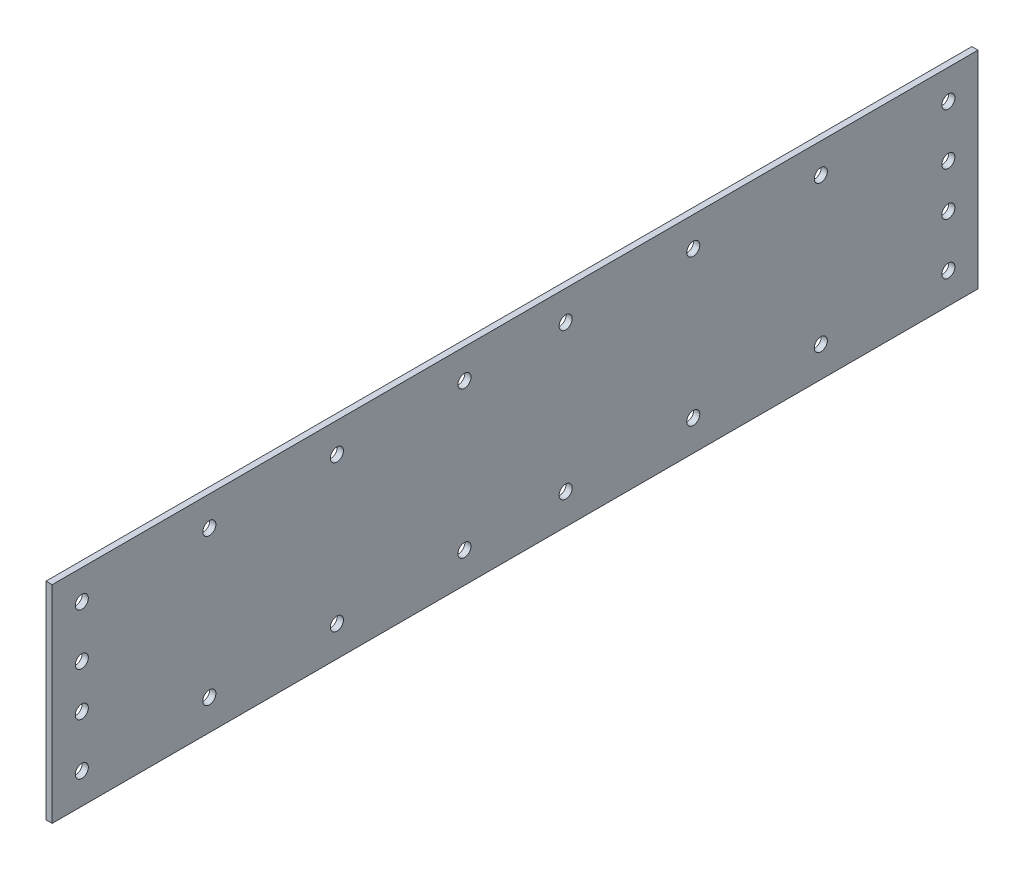
ISO-10303-21;
HEADER;
FILE_DESCRIPTION(('STEP AP214'),'2;1');
FILE_NAME('part.step','',(''),(''),'','','');
FILE_SCHEMA(('AUTOMOTIVE_DESIGN { 1 0 10303 214 1 1 1 1 }'));
ENDSEC;
DATA;
#1=APPLICATION_CONTEXT('core data for automotive mechanical design processes');
#2=APPLICATION_PROTOCOL_DEFINITION('international standard','automotive_design',2000,#1);
#3=PRODUCT_CONTEXT('',#1,'mechanical');
#4=PRODUCT('Part','Part','',(#3));
#5=PRODUCT_RELATED_PRODUCT_CATEGORY('part','',(#4));
#6=PRODUCT_DEFINITION_FORMATION('','',#4);
#7=PRODUCT_DEFINITION_CONTEXT('part definition',#1,'design');
#8=PRODUCT_DEFINITION('design','',#6,#7);
#9=PRODUCT_DEFINITION_SHAPE('','',#8);
#10=(LENGTH_UNIT() NAMED_UNIT(*) SI_UNIT(.MILLI.,.METRE.));
#11=(NAMED_UNIT(*) PLANE_ANGLE_UNIT() SI_UNIT($,.RADIAN.));
#12=(NAMED_UNIT(*) SI_UNIT($,.STERADIAN.) SOLID_ANGLE_UNIT());
#13=UNCERTAINTY_MEASURE_WITH_UNIT(LENGTH_MEASURE(1.E-05),#10,'distance_accuracy_value','');
#14=(GEOMETRIC_REPRESENTATION_CONTEXT(3) GLOBAL_UNCERTAINTY_ASSIGNED_CONTEXT((#13)) GLOBAL_UNIT_ASSIGNED_CONTEXT((#10,
#11,#12)) REPRESENTATION_CONTEXT('',''));
#15=CARTESIAN_POINT('',(0.,0.,0.));
#16=DIRECTION('',(0.,0.,1.));
#17=DIRECTION('',(1.,0.,0.));
#18=AXIS2_PLACEMENT_3D('',#15,#16,#17);
#19=CARTESIAN_POINT('',(-203.,50.,225.));
#20=DIRECTION('',(0.,0.,1.));
#21=DIRECTION('',(0.,-1.,0.));
#22=AXIS2_PLACEMENT_3D('',#19,#20,#21);
#23=PLANE('',#22);
#24=DIRECTION('',(0.,-1.,0.));
#25=VECTOR('',#24,1.);
#26=CARTESIAN_POINT('',(-200.,50.,225.));
#27=LINE('',#26,#25);
#28=CARTESIAN_POINT('',(-200.,50.,225.));
#29=VERTEX_POINT('',#28);
#30=CARTESIAN_POINT('',(-200.,-50.5044410875939,225.));
#31=VERTEX_POINT('',#30);
#32=EDGE_CURVE('E106',#29,#31,#27,.T.);
#33=ORIENTED_EDGE('',*,*,#32,.F.);
#34=DIRECTION('',(1.,0.,0.));
#35=VECTOR('',#34,1.);
#36=CARTESIAN_POINT('',(-203.,50.,225.));
#37=LINE('',#36,#35);
#38=CARTESIAN_POINT('',(-203.,50.,225.));
#39=VERTEX_POINT('',#38);
#40=EDGE_CURVE('E11',#39,#29,#37,.T.);
#41=ORIENTED_EDGE('',*,*,#40,.F.);
#42=DIRECTION('',(0.,-1.,0.));
#43=VECTOR('',#42,1.);
#44=CARTESIAN_POINT('',(-203.,50.,225.));
#45=LINE('',#44,#43);
#46=CARTESIAN_POINT('',(-203.,-50.5044410875939,225.));
#47=VERTEX_POINT('',#46);
#48=EDGE_CURVE('E99',#39,#47,#45,.T.);
#49=ORIENTED_EDGE('',*,*,#48,.T.);
#50=DIRECTION('',(1.,0.,0.));
#51=VECTOR('',#50,1.);
#52=CARTESIAN_POINT('',(-203.,-50.5044410875939,225.));
#53=LINE('',#52,#51);
#54=EDGE_CURVE('E44',#47,#31,#53,.T.);
#55=ORIENTED_EDGE('',*,*,#54,.T.);
#56=EDGE_LOOP('',(#33,#41,#49,#55));
#57=FACE_BOUND('',#56,.T.);
#58=ADVANCED_FACE('F41',(#57),#23,.T.);
#59=CARTESIAN_POINT('',(-203.,50.,225.));
#60=DIRECTION('',(0.,1.,0.));
#61=DIRECTION('',(0.,0.,1.));
#62=AXIS2_PLACEMENT_3D('',#59,#60,#61);
#63=PLANE('',#62);
#64=DIRECTION('',(0.,0.,1.));
#65=VECTOR('',#64,1.);
#66=CARTESIAN_POINT('',(-200.,50.,225.));
#67=LINE('',#66,#65);
#68=CARTESIAN_POINT('',(-200.,50.,-225.));
#69=VERTEX_POINT('',#68);
#70=EDGE_CURVE('E101',#69,#29,#67,.T.);
#71=ORIENTED_EDGE('',*,*,#70,.F.);
#72=DIRECTION('',(1.,0.,0.));
#73=VECTOR('',#72,1.);
#74=CARTESIAN_POINT('',(-203.,50.,-225.));
#75=LINE('',#74,#73);
#76=CARTESIAN_POINT('',(-203.,50.,-225.));
#77=VERTEX_POINT('',#76);
#78=EDGE_CURVE('E50',#77,#69,#75,.T.);
#79=ORIENTED_EDGE('',*,*,#78,.F.);
#80=DIRECTION('',(0.,0.,1.));
#81=VECTOR('',#80,1.);
#82=CARTESIAN_POINT('',(-203.,50.,225.));
#83=LINE('',#82,#81);
#84=EDGE_CURVE('E96',#77,#39,#83,.T.);
#85=ORIENTED_EDGE('',*,*,#84,.T.);
#86=ORIENTED_EDGE('',*,*,#40,.T.);
#87=EDGE_LOOP('',(#71,#79,#85,#86));
#88=FACE_BOUND('',#87,.T.);
#89=ADVANCED_FACE('F117',(#88),#63,.T.);
#90=CARTESIAN_POINT('',(-203.,50.,-225.));
#91=DIRECTION('',(0.,0.,-1.));
#92=DIRECTION('',(0.,1.,0.));
#93=AXIS2_PLACEMENT_3D('',#90,#91,#92);
#94=PLANE('',#93);
#95=DIRECTION('',(0.,1.,0.));
#96=VECTOR('',#95,1.);
#97=CARTESIAN_POINT('',(-200.,50.,-225.));
#98=LINE('',#97,#96);
#99=CARTESIAN_POINT('',(-200.,-50.5044410875939,-225.));
#100=VERTEX_POINT('',#99);
#101=EDGE_CURVE('E91',#100,#69,#98,.T.);
#102=ORIENTED_EDGE('',*,*,#101,.F.);
#103=DIRECTION('',(1.,0.,0.));
#104=VECTOR('',#103,1.);
#105=CARTESIAN_POINT('',(-203.,-50.5044410875939,-225.));
#106=LINE('',#105,#104);
#107=CARTESIAN_POINT('',(-203.,-50.5044410875939,-225.));
#108=VERTEX_POINT('',#107);
#109=EDGE_CURVE('E86',#108,#100,#106,.T.);
#110=ORIENTED_EDGE('',*,*,#109,.F.);
#111=DIRECTION('',(0.,1.,0.));
#112=VECTOR('',#111,1.);
#113=CARTESIAN_POINT('',(-203.,50.,-225.));
#114=LINE('',#113,#112);
#115=EDGE_CURVE('E89',#108,#77,#114,.T.);
#116=ORIENTED_EDGE('',*,*,#115,.T.);
#117=ORIENTED_EDGE('',*,*,#78,.T.);
#118=EDGE_LOOP('',(#102,#110,#116,#117));
#119=FACE_BOUND('',#118,.T.);
#120=ADVANCED_FACE('F88',(#119),#94,.T.);
#121=CARTESIAN_POINT('',(-203.,-50.5044410875939,225.));
#122=DIRECTION('',(0.,-1.,0.));
#123=DIRECTION('',(0.,0.,-1.));
#124=AXIS2_PLACEMENT_3D('',#121,#122,#123);
#125=PLANE('',#124);
#126=DIRECTION('',(0.,0.,-1.));
#127=VECTOR('',#126,1.);
#128=CARTESIAN_POINT('',(-200.,-50.5044410875939,225.));
#129=LINE('',#128,#127);
#130=EDGE_CURVE('E109',#31,#100,#129,.T.);
#131=ORIENTED_EDGE('',*,*,#130,.F.);
#132=ORIENTED_EDGE('',*,*,#54,.F.);
#133=DIRECTION('',(0.,0.,-1.));
#134=VECTOR('',#133,1.);
#135=CARTESIAN_POINT('',(-203.,-50.5044410875939,225.));
#136=LINE('',#135,#134);
#137=EDGE_CURVE('E95',#47,#108,#136,.T.);
#138=ORIENTED_EDGE('',*,*,#137,.T.);
#139=ORIENTED_EDGE('',*,*,#109,.T.);
#140=EDGE_LOOP('',(#131,#132,#138,#139));
#141=FACE_BOUND('',#140,.T.);
#142=ADVANCED_FACE('F98',(#141),#125,.T.);
#143=CARTESIAN_POINT('',(-203.,0.,0.));
#144=DIRECTION('',(1.,0.,0.));
#145=DIRECTION('',(0.,0.,-1.));
#146=AXIS2_PLACEMENT_3D('',#143,#144,#145);
#147=PLANE('',#146);
#148=CARTESIAN_POINT('',(-203.,35.6,-148.6));
#149=DIRECTION('',(1.,0.,0.));
#150=DIRECTION('',(0.,0.,1.));
#151=AXIS2_PLACEMENT_3D('',#148,#149,#150);
#152=CIRCLE('',#151,3.175);
#153=CARTESIAN_POINT('',(-203.,35.6,-145.425));
#154=VERTEX_POINT('',#153);
#155=EDGE_CURVE('E222',#154,#154,#152,.T.);
#156=ORIENTED_EDGE('',*,*,#155,.T.);
#157=EDGE_LOOP('',(#156));
#158=FACE_BOUND('',#157,.T.);
#159=CARTESIAN_POINT('',(-203.,-35.6,-148.6));
#160=DIRECTION('',(1.,0.,0.));
#161=DIRECTION('',(0.,0.,1.));
#162=AXIS2_PLACEMENT_3D('',#159,#160,#161);
#163=CIRCLE('',#162,3.175);
#164=CARTESIAN_POINT('',(-203.,-35.6,-145.425));
#165=VERTEX_POINT('',#164);
#166=EDGE_CURVE('E230',#165,#165,#163,.T.);
#167=ORIENTED_EDGE('',*,*,#166,.T.);
#168=EDGE_LOOP('',(#167));
#169=FACE_BOUND('',#168,.T.);
#170=CARTESIAN_POINT('',(-203.,35.6,-86.6));
#171=DIRECTION('',(1.,0.,0.));
#172=DIRECTION('',(0.,0.,1.));
#173=AXIS2_PLACEMENT_3D('',#170,#171,#172);
#174=CIRCLE('',#173,3.17499999999997);
#175=CARTESIAN_POINT('',(-203.,35.6,-83.4250000000001));
#176=VERTEX_POINT('',#175);
#177=EDGE_CURVE('E236',#176,#176,#174,.T.);
#178=ORIENTED_EDGE('',*,*,#177,.T.);
#179=EDGE_LOOP('',(#178));
#180=FACE_BOUND('',#179,.T.);
#181=CARTESIAN_POINT('',(-203.,-35.6,-86.6000000000001));
#182=DIRECTION('',(1.,0.,0.));
#183=DIRECTION('',(0.,0.,1.));
#184=AXIS2_PLACEMENT_3D('',#181,#182,#183);
#185=CIRCLE('',#184,3.17499999999997);
#186=CARTESIAN_POINT('',(-203.,-35.6,-83.4250000000001));
#187=VERTEX_POINT('',#186);
#188=EDGE_CURVE('E242',#187,#187,#185,.T.);
#189=ORIENTED_EDGE('',*,*,#188,.T.);
#190=EDGE_LOOP('',(#189));
#191=FACE_BOUND('',#190,.T.);
#192=CARTESIAN_POINT('',(-203.,35.6,-24.6));
#193=DIRECTION('',(1.,0.,0.));
#194=DIRECTION('',(0.,0.,1.));
#195=AXIS2_PLACEMENT_3D('',#192,#193,#194);
#196=CIRCLE('',#195,3.17499999999996);
#197=CARTESIAN_POINT('',(-203.,35.6,-21.4250000000001));
#198=VERTEX_POINT('',#197);
#199=EDGE_CURVE('E248',#198,#198,#196,.T.);
#200=ORIENTED_EDGE('',*,*,#199,.T.);
#201=EDGE_LOOP('',(#200));
#202=FACE_BOUND('',#201,.T.);
#203=CARTESIAN_POINT('',(-203.,-35.6,-24.6000000000001));
#204=DIRECTION('',(1.,0.,0.));
#205=DIRECTION('',(0.,0.,1.));
#206=AXIS2_PLACEMENT_3D('',#203,#204,#205);
#207=CIRCLE('',#206,3.17499999999996);
#208=CARTESIAN_POINT('',(-203.,-35.6,-21.4250000000001));
#209=VERTEX_POINT('',#208);
#210=EDGE_CURVE('E254',#209,#209,#207,.T.);
#211=ORIENTED_EDGE('',*,*,#210,.T.);
#212=EDGE_LOOP('',(#211));
#213=FACE_BOUND('',#212,.T.);
#214=CARTESIAN_POINT('',(-203.,35.6,24.6000000000001));
#215=DIRECTION('',(1.,0.,0.));
#216=DIRECTION('',(0.,0.,-1.));
#217=AXIS2_PLACEMENT_3D('',#214,#215,#216);
#218=CIRCLE('',#217,3.17499999999997);
#219=CARTESIAN_POINT('',(-203.,35.6,21.4250000000001));
#220=VERTEX_POINT('',#219);
#221=EDGE_CURVE('E260',#220,#220,#218,.T.);
#222=ORIENTED_EDGE('',*,*,#221,.T.);
#223=EDGE_LOOP('',(#222));
#224=FACE_BOUND('',#223,.T.);
#225=CARTESIAN_POINT('',(-203.,-35.6,24.6000000000001));
#226=DIRECTION('',(1.,0.,0.));
#227=DIRECTION('',(0.,0.,-1.));
#228=AXIS2_PLACEMENT_3D('',#225,#226,#227);
#229=CIRCLE('',#228,3.17499999999997);
#230=CARTESIAN_POINT('',(-203.,-35.6,21.4250000000001));
#231=VERTEX_POINT('',#230);
#232=EDGE_CURVE('E266',#231,#231,#229,.T.);
#233=ORIENTED_EDGE('',*,*,#232,.T.);
#234=EDGE_LOOP('',(#233));
#235=FACE_BOUND('',#234,.T.);
#236=CARTESIAN_POINT('',(-203.,35.6,86.6000000000001));
#237=DIRECTION('',(1.,0.,0.));
#238=DIRECTION('',(0.,0.,-1.));
#239=AXIS2_PLACEMENT_3D('',#236,#237,#238);
#240=CIRCLE('',#239,3.17499999999997);
#241=CARTESIAN_POINT('',(-203.,35.6,83.4250000000001));
#242=VERTEX_POINT('',#241);
#243=EDGE_CURVE('E272',#242,#242,#240,.T.);
#244=ORIENTED_EDGE('',*,*,#243,.T.);
#245=EDGE_LOOP('',(#244));
#246=FACE_BOUND('',#245,.T.);
#247=CARTESIAN_POINT('',(-203.,-35.6,86.6000000000001));
#248=DIRECTION('',(1.,0.,0.));
#249=DIRECTION('',(0.,0.,-1.));
#250=AXIS2_PLACEMENT_3D('',#247,#248,#249);
#251=CIRCLE('',#250,3.17499999999997);
#252=CARTESIAN_POINT('',(-203.,-35.6,83.4250000000001));
#253=VERTEX_POINT('',#252);
#254=EDGE_CURVE('E278',#253,#253,#251,.T.);
#255=ORIENTED_EDGE('',*,*,#254,.T.);
#256=EDGE_LOOP('',(#255));
#257=FACE_BOUND('',#256,.T.);
#258=CARTESIAN_POINT('',(-203.,35.6,148.6));
#259=DIRECTION('',(1.,0.,0.));
#260=DIRECTION('',(0.,0.,-1.));
#261=AXIS2_PLACEMENT_3D('',#258,#259,#260);
#262=CIRCLE('',#261,3.175);
#263=CARTESIAN_POINT('',(-203.,35.6,145.425));
#264=VERTEX_POINT('',#263);
#265=EDGE_CURVE('E284',#264,#264,#262,.T.);
#266=ORIENTED_EDGE('',*,*,#265,.T.);
#267=EDGE_LOOP('',(#266));
#268=FACE_BOUND('',#267,.T.);
#269=CARTESIAN_POINT('',(-203.,-35.6,148.6));
#270=DIRECTION('',(1.,0.,0.));
#271=DIRECTION('',(0.,0.,-1.));
#272=AXIS2_PLACEMENT_3D('',#269,#270,#271);
#273=CIRCLE('',#272,3.175);
#274=CARTESIAN_POINT('',(-203.,-35.6,145.425));
#275=VERTEX_POINT('',#274);
#276=EDGE_CURVE('E290',#275,#275,#273,.T.);
#277=ORIENTED_EDGE('',*,*,#276,.T.);
#278=EDGE_LOOP('',(#277));
#279=FACE_BOUND('',#278,.T.);
#280=CARTESIAN_POINT('',(-203.,10.6,210.6));
#281=DIRECTION('',(1.,0.,0.));
#282=DIRECTION('',(0.,0.,-1.));
#283=AXIS2_PLACEMENT_3D('',#280,#281,#282);
#284=CIRCLE('',#283,3.175);
#285=CARTESIAN_POINT('',(-203.,10.6,207.425));
#286=VERTEX_POINT('',#285);
#287=EDGE_CURVE('E296',#286,#286,#284,.T.);
#288=ORIENTED_EDGE('',*,*,#287,.T.);
#289=EDGE_LOOP('',(#288));
#290=FACE_BOUND('',#289,.T.);
#291=CARTESIAN_POINT('',(-203.,-10.6,210.6));
#292=DIRECTION('',(1.,0.,0.));
#293=DIRECTION('',(0.,0.,-1.));
#294=AXIS2_PLACEMENT_3D('',#291,#292,#293);
#295=CIRCLE('',#294,3.175);
#296=CARTESIAN_POINT('',(-203.,-10.6,207.425));
#297=VERTEX_POINT('',#296);
#298=EDGE_CURVE('E302',#297,#297,#295,.T.);
#299=ORIENTED_EDGE('',*,*,#298,.T.);
#300=EDGE_LOOP('',(#299));
#301=FACE_BOUND('',#300,.T.);
#302=CARTESIAN_POINT('',(-203.,10.6,-210.6));
#303=DIRECTION('',(1.,0.,0.));
#304=DIRECTION('',(0.,0.,-1.));
#305=AXIS2_PLACEMENT_3D('',#302,#303,#304);
#306=CIRCLE('',#305,3.175);
#307=CARTESIAN_POINT('',(-203.,10.6,-213.775));
#308=VERTEX_POINT('',#307);
#309=EDGE_CURVE('E308',#308,#308,#306,.T.);
#310=ORIENTED_EDGE('',*,*,#309,.T.);
#311=EDGE_LOOP('',(#310));
#312=FACE_BOUND('',#311,.T.);
#313=CARTESIAN_POINT('',(-203.,-10.6,-210.6));
#314=DIRECTION('',(1.,0.,0.));
#315=DIRECTION('',(0.,0.,-1.));
#316=AXIS2_PLACEMENT_3D('',#313,#314,#315);
#317=CIRCLE('',#316,3.175);
#318=CARTESIAN_POINT('',(-203.,-10.6,-213.775));
#319=VERTEX_POINT('',#318);
#320=EDGE_CURVE('E314',#319,#319,#317,.T.);
#321=ORIENTED_EDGE('',*,*,#320,.T.);
#322=EDGE_LOOP('',(#321));
#323=FACE_BOUND('',#322,.T.);
#324=CARTESIAN_POINT('',(-203.,35.6,210.6));
#325=DIRECTION('',(1.,0.,0.));
#326=DIRECTION('',(0.,0.,-1.));
#327=AXIS2_PLACEMENT_3D('',#324,#325,#326);
#328=CIRCLE('',#327,3.175);
#329=CARTESIAN_POINT('',(-203.,35.6,207.425));
#330=VERTEX_POINT('',#329);
#331=EDGE_CURVE('E320',#330,#330,#328,.T.);
#332=ORIENTED_EDGE('',*,*,#331,.T.);
#333=EDGE_LOOP('',(#332));
#334=FACE_BOUND('',#333,.T.);
#335=CARTESIAN_POINT('',(-203.,-35.6,210.6));
#336=DIRECTION('',(1.,0.,0.));
#337=DIRECTION('',(0.,0.,-1.));
#338=AXIS2_PLACEMENT_3D('',#335,#336,#337);
#339=CIRCLE('',#338,3.175);
#340=CARTESIAN_POINT('',(-203.,-35.6,207.425));
#341=VERTEX_POINT('',#340);
#342=EDGE_CURVE('E326',#341,#341,#339,.T.);
#343=ORIENTED_EDGE('',*,*,#342,.T.);
#344=EDGE_LOOP('',(#343));
#345=FACE_BOUND('',#344,.T.);
#346=CARTESIAN_POINT('',(-203.,35.6,-210.6));
#347=DIRECTION('',(1.,0.,0.));
#348=DIRECTION('',(0.,0.,-1.));
#349=AXIS2_PLACEMENT_3D('',#346,#347,#348);
#350=CIRCLE('',#349,3.175);
#351=CARTESIAN_POINT('',(-203.,35.6,-213.775));
#352=VERTEX_POINT('',#351);
#353=EDGE_CURVE('E332',#352,#352,#350,.T.);
#354=ORIENTED_EDGE('',*,*,#353,.T.);
#355=EDGE_LOOP('',(#354));
#356=FACE_BOUND('',#355,.T.);
#357=CARTESIAN_POINT('',(-203.,-35.6,-210.6));
#358=DIRECTION('',(1.,0.,0.));
#359=DIRECTION('',(0.,0.,-1.));
#360=AXIS2_PLACEMENT_3D('',#357,#358,#359);
#361=CIRCLE('',#360,3.175);
#362=CARTESIAN_POINT('',(-203.,-35.6,-213.775));
#363=VERTEX_POINT('',#362);
#364=EDGE_CURVE('E110',#363,#363,#361,.T.);
#365=ORIENTED_EDGE('',*,*,#364,.T.);
#366=EDGE_LOOP('',(#365));
#367=FACE_BOUND('',#366,.T.);
#368=ORIENTED_EDGE('',*,*,#48,.F.);
#369=ORIENTED_EDGE('',*,*,#84,.F.);
#370=ORIENTED_EDGE('',*,*,#115,.F.);
#371=ORIENTED_EDGE('',*,*,#137,.F.);
#372=EDGE_LOOP('',(#368,#369,#370,#371));
#373=FACE_BOUND('',#372,.T.);
#374=ADVANCED_FACE('F94',(#158,#169,#180,#191,#202,#213,#224,#235,#246,#257,#268,#279,#290,#301,
#312,#323,#334,#345,#356,#367,#373),#147,.F.);
#375=CARTESIAN_POINT('',(-200.,0.,0.));
#376=DIRECTION('',(1.,0.,0.));
#377=DIRECTION('',(0.,0.,-1.));
#378=AXIS2_PLACEMENT_3D('',#375,#376,#377);
#379=PLANE('',#378);
#380=CARTESIAN_POINT('',(-200.,35.6,-148.6));
#381=DIRECTION('',(1.,0.,0.));
#382=DIRECTION('',(0.,0.,1.));
#383=AXIS2_PLACEMENT_3D('',#380,#381,#382);
#384=CIRCLE('',#383,3.175);
#385=CARTESIAN_POINT('',(-200.,35.6,-145.425));
#386=VERTEX_POINT('',#385);
#387=EDGE_CURVE('E225',#386,#386,#384,.T.);
#388=ORIENTED_EDGE('',*,*,#387,.F.);
#389=EDGE_LOOP('',(#388));
#390=FACE_BOUND('',#389,.T.);
#391=CARTESIAN_POINT('',(-200.,-35.6,-148.6));
#392=DIRECTION('',(1.,0.,0.));
#393=DIRECTION('',(0.,0.,1.));
#394=AXIS2_PLACEMENT_3D('',#391,#392,#393);
#395=CIRCLE('',#394,3.175);
#396=CARTESIAN_POINT('',(-200.,-35.6,-145.425));
#397=VERTEX_POINT('',#396);
#398=EDGE_CURVE('E227',#397,#397,#395,.T.);
#399=ORIENTED_EDGE('',*,*,#398,.F.);
#400=EDGE_LOOP('',(#399));
#401=FACE_BOUND('',#400,.T.);
#402=CARTESIAN_POINT('',(-200.,35.6,-86.6));
#403=DIRECTION('',(1.,0.,0.));
#404=DIRECTION('',(0.,0.,1.));
#405=AXIS2_PLACEMENT_3D('',#402,#403,#404);
#406=CIRCLE('',#405,3.17499999999997);
#407=CARTESIAN_POINT('',(-200.,35.6,-83.4250000000001));
#408=VERTEX_POINT('',#407);
#409=EDGE_CURVE('E233',#408,#408,#406,.T.);
#410=ORIENTED_EDGE('',*,*,#409,.F.);
#411=EDGE_LOOP('',(#410));
#412=FACE_BOUND('',#411,.T.);
#413=CARTESIAN_POINT('',(-200.,-35.6,-86.6000000000001));
#414=DIRECTION('',(1.,0.,0.));
#415=DIRECTION('',(0.,0.,1.));
#416=AXIS2_PLACEMENT_3D('',#413,#414,#415);
#417=CIRCLE('',#416,3.17499999999997);
#418=CARTESIAN_POINT('',(-200.,-35.6,-83.4250000000001));
#419=VERTEX_POINT('',#418);
#420=EDGE_CURVE('E239',#419,#419,#417,.T.);
#421=ORIENTED_EDGE('',*,*,#420,.F.);
#422=EDGE_LOOP('',(#421));
#423=FACE_BOUND('',#422,.T.);
#424=CARTESIAN_POINT('',(-200.,35.6,-24.6));
#425=DIRECTION('',(1.,0.,0.));
#426=DIRECTION('',(0.,0.,1.));
#427=AXIS2_PLACEMENT_3D('',#424,#425,#426);
#428=CIRCLE('',#427,3.17499999999996);
#429=CARTESIAN_POINT('',(-200.,35.6,-21.4250000000001));
#430=VERTEX_POINT('',#429);
#431=EDGE_CURVE('E245',#430,#430,#428,.T.);
#432=ORIENTED_EDGE('',*,*,#431,.F.);
#433=EDGE_LOOP('',(#432));
#434=FACE_BOUND('',#433,.T.);
#435=CARTESIAN_POINT('',(-200.,-35.6,-24.6000000000001));
#436=DIRECTION('',(1.,0.,0.));
#437=DIRECTION('',(0.,0.,1.));
#438=AXIS2_PLACEMENT_3D('',#435,#436,#437);
#439=CIRCLE('',#438,3.17499999999996);
#440=CARTESIAN_POINT('',(-200.,-35.6,-21.4250000000001));
#441=VERTEX_POINT('',#440);
#442=EDGE_CURVE('E251',#441,#441,#439,.T.);
#443=ORIENTED_EDGE('',*,*,#442,.F.);
#444=EDGE_LOOP('',(#443));
#445=FACE_BOUND('',#444,.T.);
#446=CARTESIAN_POINT('',(-200.,35.6,24.6000000000001));
#447=DIRECTION('',(1.,0.,0.));
#448=DIRECTION('',(0.,0.,-1.));
#449=AXIS2_PLACEMENT_3D('',#446,#447,#448);
#450=CIRCLE('',#449,3.17499999999997);
#451=CARTESIAN_POINT('',(-200.,35.6,21.4250000000001));
#452=VERTEX_POINT('',#451);
#453=EDGE_CURVE('E257',#452,#452,#450,.T.);
#454=ORIENTED_EDGE('',*,*,#453,.F.);
#455=EDGE_LOOP('',(#454));
#456=FACE_BOUND('',#455,.T.);
#457=CARTESIAN_POINT('',(-200.,-35.6,24.6000000000001));
#458=DIRECTION('',(1.,0.,0.));
#459=DIRECTION('',(0.,0.,-1.));
#460=AXIS2_PLACEMENT_3D('',#457,#458,#459);
#461=CIRCLE('',#460,3.17499999999997);
#462=CARTESIAN_POINT('',(-200.,-35.6,21.4250000000001));
#463=VERTEX_POINT('',#462);
#464=EDGE_CURVE('E263',#463,#463,#461,.T.);
#465=ORIENTED_EDGE('',*,*,#464,.F.);
#466=EDGE_LOOP('',(#465));
#467=FACE_BOUND('',#466,.T.);
#468=CARTESIAN_POINT('',(-200.,35.6,86.6000000000001));
#469=DIRECTION('',(1.,0.,0.));
#470=DIRECTION('',(0.,0.,-1.));
#471=AXIS2_PLACEMENT_3D('',#468,#469,#470);
#472=CIRCLE('',#471,3.17499999999997);
#473=CARTESIAN_POINT('',(-200.,35.6,83.4250000000001));
#474=VERTEX_POINT('',#473);
#475=EDGE_CURVE('E269',#474,#474,#472,.T.);
#476=ORIENTED_EDGE('',*,*,#475,.F.);
#477=EDGE_LOOP('',(#476));
#478=FACE_BOUND('',#477,.T.);
#479=CARTESIAN_POINT('',(-200.,-35.6,86.6000000000001));
#480=DIRECTION('',(1.,0.,0.));
#481=DIRECTION('',(0.,0.,-1.));
#482=AXIS2_PLACEMENT_3D('',#479,#480,#481);
#483=CIRCLE('',#482,3.17499999999997);
#484=CARTESIAN_POINT('',(-200.,-35.6,83.4250000000001));
#485=VERTEX_POINT('',#484);
#486=EDGE_CURVE('E275',#485,#485,#483,.T.);
#487=ORIENTED_EDGE('',*,*,#486,.F.);
#488=EDGE_LOOP('',(#487));
#489=FACE_BOUND('',#488,.T.);
#490=CARTESIAN_POINT('',(-200.,35.6,148.6));
#491=DIRECTION('',(1.,0.,0.));
#492=DIRECTION('',(0.,0.,-1.));
#493=AXIS2_PLACEMENT_3D('',#490,#491,#492);
#494=CIRCLE('',#493,3.175);
#495=CARTESIAN_POINT('',(-200.,35.6,145.425));
#496=VERTEX_POINT('',#495);
#497=EDGE_CURVE('E281',#496,#496,#494,.T.);
#498=ORIENTED_EDGE('',*,*,#497,.F.);
#499=EDGE_LOOP('',(#498));
#500=FACE_BOUND('',#499,.T.);
#501=CARTESIAN_POINT('',(-200.,-35.6,148.6));
#502=DIRECTION('',(1.,0.,0.));
#503=DIRECTION('',(0.,0.,-1.));
#504=AXIS2_PLACEMENT_3D('',#501,#502,#503);
#505=CIRCLE('',#504,3.175);
#506=CARTESIAN_POINT('',(-200.,-35.6,145.425));
#507=VERTEX_POINT('',#506);
#508=EDGE_CURVE('E287',#507,#507,#505,.T.);
#509=ORIENTED_EDGE('',*,*,#508,.F.);
#510=EDGE_LOOP('',(#509));
#511=FACE_BOUND('',#510,.T.);
#512=CARTESIAN_POINT('',(-200.,10.6,210.6));
#513=DIRECTION('',(1.,0.,0.));
#514=DIRECTION('',(0.,0.,-1.));
#515=AXIS2_PLACEMENT_3D('',#512,#513,#514);
#516=CIRCLE('',#515,3.175);
#517=CARTESIAN_POINT('',(-200.,10.6,207.425));
#518=VERTEX_POINT('',#517);
#519=EDGE_CURVE('E293',#518,#518,#516,.T.);
#520=ORIENTED_EDGE('',*,*,#519,.F.);
#521=EDGE_LOOP('',(#520));
#522=FACE_BOUND('',#521,.T.);
#523=CARTESIAN_POINT('',(-200.,-10.6,210.6));
#524=DIRECTION('',(1.,0.,0.));
#525=DIRECTION('',(0.,0.,-1.));
#526=AXIS2_PLACEMENT_3D('',#523,#524,#525);
#527=CIRCLE('',#526,3.175);
#528=CARTESIAN_POINT('',(-200.,-10.6,207.425));
#529=VERTEX_POINT('',#528);
#530=EDGE_CURVE('E299',#529,#529,#527,.T.);
#531=ORIENTED_EDGE('',*,*,#530,.F.);
#532=EDGE_LOOP('',(#531));
#533=FACE_BOUND('',#532,.T.);
#534=CARTESIAN_POINT('',(-200.,10.6,-210.6));
#535=DIRECTION('',(1.,0.,0.));
#536=DIRECTION('',(0.,0.,-1.));
#537=AXIS2_PLACEMENT_3D('',#534,#535,#536);
#538=CIRCLE('',#537,3.175);
#539=CARTESIAN_POINT('',(-200.,10.6,-213.775));
#540=VERTEX_POINT('',#539);
#541=EDGE_CURVE('E305',#540,#540,#538,.T.);
#542=ORIENTED_EDGE('',*,*,#541,.F.);
#543=EDGE_LOOP('',(#542));
#544=FACE_BOUND('',#543,.T.);
#545=CARTESIAN_POINT('',(-200.,-10.6,-210.6));
#546=DIRECTION('',(1.,0.,0.));
#547=DIRECTION('',(0.,0.,-1.));
#548=AXIS2_PLACEMENT_3D('',#545,#546,#547);
#549=CIRCLE('',#548,3.175);
#550=CARTESIAN_POINT('',(-200.,-10.6,-213.775));
#551=VERTEX_POINT('',#550);
#552=EDGE_CURVE('E311',#551,#551,#549,.T.);
#553=ORIENTED_EDGE('',*,*,#552,.F.);
#554=EDGE_LOOP('',(#553));
#555=FACE_BOUND('',#554,.T.);
#556=CARTESIAN_POINT('',(-200.,35.6,210.6));
#557=DIRECTION('',(1.,0.,0.));
#558=DIRECTION('',(0.,0.,-1.));
#559=AXIS2_PLACEMENT_3D('',#556,#557,#558);
#560=CIRCLE('',#559,3.175);
#561=CARTESIAN_POINT('',(-200.,35.6,207.425));
#562=VERTEX_POINT('',#561);
#563=EDGE_CURVE('E317',#562,#562,#560,.T.);
#564=ORIENTED_EDGE('',*,*,#563,.F.);
#565=EDGE_LOOP('',(#564));
#566=FACE_BOUND('',#565,.T.);
#567=CARTESIAN_POINT('',(-200.,-35.6,210.6));
#568=DIRECTION('',(1.,0.,0.));
#569=DIRECTION('',(0.,0.,-1.));
#570=AXIS2_PLACEMENT_3D('',#567,#568,#569);
#571=CIRCLE('',#570,3.175);
#572=CARTESIAN_POINT('',(-200.,-35.6,207.425));
#573=VERTEX_POINT('',#572);
#574=EDGE_CURVE('E323',#573,#573,#571,.T.);
#575=ORIENTED_EDGE('',*,*,#574,.F.);
#576=EDGE_LOOP('',(#575));
#577=FACE_BOUND('',#576,.T.);
#578=CARTESIAN_POINT('',(-200.,35.6,-210.6));
#579=DIRECTION('',(1.,0.,0.));
#580=DIRECTION('',(0.,0.,-1.));
#581=AXIS2_PLACEMENT_3D('',#578,#579,#580);
#582=CIRCLE('',#581,3.175);
#583=CARTESIAN_POINT('',(-200.,35.6,-213.775));
#584=VERTEX_POINT('',#583);
#585=EDGE_CURVE('E329',#584,#584,#582,.T.);
#586=ORIENTED_EDGE('',*,*,#585,.F.);
#587=EDGE_LOOP('',(#586));
#588=FACE_BOUND('',#587,.T.);
#589=CARTESIAN_POINT('',(-200.,-35.6,-210.6));
#590=DIRECTION('',(1.,0.,0.));
#591=DIRECTION('',(0.,0.,-1.));
#592=AXIS2_PLACEMENT_3D('',#589,#590,#591);
#593=CIRCLE('',#592,3.175);
#594=CARTESIAN_POINT('',(-200.,-35.6,-213.775));
#595=VERTEX_POINT('',#594);
#596=EDGE_CURVE('E335',#595,#595,#593,.T.);
#597=ORIENTED_EDGE('',*,*,#596,.F.);
#598=EDGE_LOOP('',(#597));
#599=FACE_BOUND('',#598,.T.);
#600=ORIENTED_EDGE('',*,*,#32,.T.);
#601=ORIENTED_EDGE('',*,*,#130,.T.);
#602=ORIENTED_EDGE('',*,*,#101,.T.);
#603=ORIENTED_EDGE('',*,*,#70,.T.);
#604=EDGE_LOOP('',(#600,#601,#602,#603));
#605=FACE_BOUND('',#604,.T.);
#606=ADVANCED_FACE('F116',(#390,#401,#412,#423,#434,#445,#456,#467,#478,#489,#500,#511,#522,
#533,#544,#555,#566,#577,#588,#599,#605),#379,.T.);
#607=CARTESIAN_POINT('',(-203.,-35.6,-210.6));
#608=DIRECTION('',(1.,0.,0.));
#609=DIRECTION('',(0.,0.,-1.));
#610=AXIS2_PLACEMENT_3D('',#607,#608,#609);
#611=CYLINDRICAL_SURFACE('',#610,3.175);
#612=ORIENTED_EDGE('',*,*,#364,.F.);
#613=EDGE_LOOP('',(#612));
#614=FACE_BOUND('',#613,.T.);
#615=ORIENTED_EDGE('',*,*,#596,.T.);
#616=EDGE_LOOP('',(#615));
#617=FACE_BOUND('',#616,.T.);
#618=ADVANCED_FACE('F135',(#614,#617),#611,.F.);
#619=CARTESIAN_POINT('',(-203.,35.6,-210.6));
#620=DIRECTION('',(1.,0.,0.));
#621=DIRECTION('',(0.,0.,-1.));
#622=AXIS2_PLACEMENT_3D('',#619,#620,#621);
#623=CYLINDRICAL_SURFACE('',#622,3.175);
#624=ORIENTED_EDGE('',*,*,#353,.F.);
#625=EDGE_LOOP('',(#624));
#626=FACE_BOUND('',#625,.T.);
#627=ORIENTED_EDGE('',*,*,#585,.T.);
#628=EDGE_LOOP('',(#627));
#629=FACE_BOUND('',#628,.T.);
#630=ADVANCED_FACE('F142',(#626,#629),#623,.F.);
#631=CARTESIAN_POINT('',(-203.,-35.6,210.6));
#632=DIRECTION('',(1.,0.,0.));
#633=DIRECTION('',(0.,0.,-1.));
#634=AXIS2_PLACEMENT_3D('',#631,#632,#633);
#635=CYLINDRICAL_SURFACE('',#634,3.175);
#636=ORIENTED_EDGE('',*,*,#342,.F.);
#637=EDGE_LOOP('',(#636));
#638=FACE_BOUND('',#637,.T.);
#639=ORIENTED_EDGE('',*,*,#574,.T.);
#640=EDGE_LOOP('',(#639));
#641=FACE_BOUND('',#640,.T.);
#642=ADVANCED_FACE('F146',(#638,#641),#635,.F.);
#643=CARTESIAN_POINT('',(-203.,35.6,210.6));
#644=DIRECTION('',(1.,0.,0.));
#645=DIRECTION('',(0.,0.,-1.));
#646=AXIS2_PLACEMENT_3D('',#643,#644,#645);
#647=CYLINDRICAL_SURFACE('',#646,3.175);
#648=ORIENTED_EDGE('',*,*,#331,.F.);
#649=EDGE_LOOP('',(#648));
#650=FACE_BOUND('',#649,.T.);
#651=ORIENTED_EDGE('',*,*,#563,.T.);
#652=EDGE_LOOP('',(#651));
#653=FACE_BOUND('',#652,.T.);
#654=ADVANCED_FACE('F150',(#650,#653),#647,.F.);
#655=CARTESIAN_POINT('',(-203.,-10.6,-210.6));
#656=DIRECTION('',(1.,0.,0.));
#657=DIRECTION('',(0.,0.,-1.));
#658=AXIS2_PLACEMENT_3D('',#655,#656,#657);
#659=CYLINDRICAL_SURFACE('',#658,3.175);
#660=ORIENTED_EDGE('',*,*,#320,.F.);
#661=EDGE_LOOP('',(#660));
#662=FACE_BOUND('',#661,.T.);
#663=ORIENTED_EDGE('',*,*,#552,.T.);
#664=EDGE_LOOP('',(#663));
#665=FACE_BOUND('',#664,.T.);
#666=ADVANCED_FACE('F154',(#662,#665),#659,.F.);
#667=CARTESIAN_POINT('',(-203.,10.6,-210.6));
#668=DIRECTION('',(1.,0.,0.));
#669=DIRECTION('',(0.,0.,-1.));
#670=AXIS2_PLACEMENT_3D('',#667,#668,#669);
#671=CYLINDRICAL_SURFACE('',#670,3.175);
#672=ORIENTED_EDGE('',*,*,#309,.F.);
#673=EDGE_LOOP('',(#672));
#674=FACE_BOUND('',#673,.T.);
#675=ORIENTED_EDGE('',*,*,#541,.T.);
#676=EDGE_LOOP('',(#675));
#677=FACE_BOUND('',#676,.T.);
#678=ADVANCED_FACE('F158',(#674,#677),#671,.F.);
#679=CARTESIAN_POINT('',(-203.,-10.6,210.6));
#680=DIRECTION('',(1.,0.,0.));
#681=DIRECTION('',(0.,0.,-1.));
#682=AXIS2_PLACEMENT_3D('',#679,#680,#681);
#683=CYLINDRICAL_SURFACE('',#682,3.175);
#684=ORIENTED_EDGE('',*,*,#298,.F.);
#685=EDGE_LOOP('',(#684));
#686=FACE_BOUND('',#685,.T.);
#687=ORIENTED_EDGE('',*,*,#530,.T.);
#688=EDGE_LOOP('',(#687));
#689=FACE_BOUND('',#688,.T.);
#690=ADVANCED_FACE('F162',(#686,#689),#683,.F.);
#691=CARTESIAN_POINT('',(-203.,10.6,210.6));
#692=DIRECTION('',(1.,0.,0.));
#693=DIRECTION('',(0.,0.,-1.));
#694=AXIS2_PLACEMENT_3D('',#691,#692,#693);
#695=CYLINDRICAL_SURFACE('',#694,3.175);
#696=ORIENTED_EDGE('',*,*,#287,.F.);
#697=EDGE_LOOP('',(#696));
#698=FACE_BOUND('',#697,.T.);
#699=ORIENTED_EDGE('',*,*,#519,.T.);
#700=EDGE_LOOP('',(#699));
#701=FACE_BOUND('',#700,.T.);
#702=ADVANCED_FACE('F166',(#698,#701),#695,.F.);
#703=CARTESIAN_POINT('',(-203.,-35.6,148.6));
#704=DIRECTION('',(1.,0.,0.));
#705=DIRECTION('',(0.,0.,-1.));
#706=AXIS2_PLACEMENT_3D('',#703,#704,#705);
#707=CYLINDRICAL_SURFACE('',#706,3.175);
#708=ORIENTED_EDGE('',*,*,#276,.F.);
#709=EDGE_LOOP('',(#708));
#710=FACE_BOUND('',#709,.T.);
#711=ORIENTED_EDGE('',*,*,#508,.T.);
#712=EDGE_LOOP('',(#711));
#713=FACE_BOUND('',#712,.T.);
#714=ADVANCED_FACE('F170',(#710,#713),#707,.F.);
#715=CARTESIAN_POINT('',(-203.,35.6,148.6));
#716=DIRECTION('',(1.,0.,0.));
#717=DIRECTION('',(0.,0.,-1.));
#718=AXIS2_PLACEMENT_3D('',#715,#716,#717);
#719=CYLINDRICAL_SURFACE('',#718,3.175);
#720=ORIENTED_EDGE('',*,*,#265,.F.);
#721=EDGE_LOOP('',(#720));
#722=FACE_BOUND('',#721,.T.);
#723=ORIENTED_EDGE('',*,*,#497,.T.);
#724=EDGE_LOOP('',(#723));
#725=FACE_BOUND('',#724,.T.);
#726=ADVANCED_FACE('F174',(#722,#725),#719,.F.);
#727=CARTESIAN_POINT('',(-203.,-35.6,86.6000000000001));
#728=DIRECTION('',(1.,0.,0.));
#729=DIRECTION('',(0.,0.,-1.));
#730=AXIS2_PLACEMENT_3D('',#727,#728,#729);
#731=CYLINDRICAL_SURFACE('',#730,3.17499999999997);
#732=ORIENTED_EDGE('',*,*,#254,.F.);
#733=EDGE_LOOP('',(#732));
#734=FACE_BOUND('',#733,.T.);
#735=ORIENTED_EDGE('',*,*,#486,.T.);
#736=EDGE_LOOP('',(#735));
#737=FACE_BOUND('',#736,.T.);
#738=ADVANCED_FACE('F178',(#734,#737),#731,.F.);
#739=CARTESIAN_POINT('',(-203.,35.6,86.6000000000001));
#740=DIRECTION('',(1.,0.,0.));
#741=DIRECTION('',(0.,0.,-1.));
#742=AXIS2_PLACEMENT_3D('',#739,#740,#741);
#743=CYLINDRICAL_SURFACE('',#742,3.17499999999997);
#744=ORIENTED_EDGE('',*,*,#243,.F.);
#745=EDGE_LOOP('',(#744));
#746=FACE_BOUND('',#745,.T.);
#747=ORIENTED_EDGE('',*,*,#475,.T.);
#748=EDGE_LOOP('',(#747));
#749=FACE_BOUND('',#748,.T.);
#750=ADVANCED_FACE('F182',(#746,#749),#743,.F.);
#751=CARTESIAN_POINT('',(-203.,-35.6,24.6000000000001));
#752=DIRECTION('',(1.,0.,0.));
#753=DIRECTION('',(0.,0.,-1.));
#754=AXIS2_PLACEMENT_3D('',#751,#752,#753);
#755=CYLINDRICAL_SURFACE('',#754,3.17499999999997);
#756=ORIENTED_EDGE('',*,*,#232,.F.);
#757=EDGE_LOOP('',(#756));
#758=FACE_BOUND('',#757,.T.);
#759=ORIENTED_EDGE('',*,*,#464,.T.);
#760=EDGE_LOOP('',(#759));
#761=FACE_BOUND('',#760,.T.);
#762=ADVANCED_FACE('F186',(#758,#761),#755,.F.);
#763=CARTESIAN_POINT('',(-203.,35.6,24.6000000000001));
#764=DIRECTION('',(1.,0.,0.));
#765=DIRECTION('',(0.,0.,-1.));
#766=AXIS2_PLACEMENT_3D('',#763,#764,#765);
#767=CYLINDRICAL_SURFACE('',#766,3.17499999999997);
#768=ORIENTED_EDGE('',*,*,#221,.F.);
#769=EDGE_LOOP('',(#768));
#770=FACE_BOUND('',#769,.T.);
#771=ORIENTED_EDGE('',*,*,#453,.T.);
#772=EDGE_LOOP('',(#771));
#773=FACE_BOUND('',#772,.T.);
#774=ADVANCED_FACE('F190',(#770,#773),#767,.F.);
#775=CARTESIAN_POINT('',(-203.,-35.6,-24.6000000000001));
#776=DIRECTION('',(1.,0.,0.));
#777=DIRECTION('',(0.,0.,-1.));
#778=AXIS2_PLACEMENT_3D('',#775,#776,#777);
#779=CYLINDRICAL_SURFACE('',#778,3.17499999999996);
#780=ORIENTED_EDGE('',*,*,#210,.F.);
#781=EDGE_LOOP('',(#780));
#782=FACE_BOUND('',#781,.T.);
#783=ORIENTED_EDGE('',*,*,#442,.T.);
#784=EDGE_LOOP('',(#783));
#785=FACE_BOUND('',#784,.T.);
#786=ADVANCED_FACE('F194',(#782,#785),#779,.F.);
#787=CARTESIAN_POINT('',(-203.,35.6,-24.6));
#788=DIRECTION('',(1.,0.,0.));
#789=DIRECTION('',(0.,0.,-1.));
#790=AXIS2_PLACEMENT_3D('',#787,#788,#789);
#791=CYLINDRICAL_SURFACE('',#790,3.17499999999996);
#792=ORIENTED_EDGE('',*,*,#199,.F.);
#793=EDGE_LOOP('',(#792));
#794=FACE_BOUND('',#793,.T.);
#795=ORIENTED_EDGE('',*,*,#431,.T.);
#796=EDGE_LOOP('',(#795));
#797=FACE_BOUND('',#796,.T.);
#798=ADVANCED_FACE('F198',(#794,#797),#791,.F.);
#799=CARTESIAN_POINT('',(-203.,-35.6,-86.6000000000001));
#800=DIRECTION('',(1.,0.,0.));
#801=DIRECTION('',(0.,0.,-1.));
#802=AXIS2_PLACEMENT_3D('',#799,#800,#801);
#803=CYLINDRICAL_SURFACE('',#802,3.17499999999997);
#804=ORIENTED_EDGE('',*,*,#188,.F.);
#805=EDGE_LOOP('',(#804));
#806=FACE_BOUND('',#805,.T.);
#807=ORIENTED_EDGE('',*,*,#420,.T.);
#808=EDGE_LOOP('',(#807));
#809=FACE_BOUND('',#808,.T.);
#810=ADVANCED_FACE('F202',(#806,#809),#803,.F.);
#811=CARTESIAN_POINT('',(-203.,35.6,-86.6));
#812=DIRECTION('',(1.,0.,0.));
#813=DIRECTION('',(0.,0.,-1.));
#814=AXIS2_PLACEMENT_3D('',#811,#812,#813);
#815=CYLINDRICAL_SURFACE('',#814,3.17499999999997);
#816=ORIENTED_EDGE('',*,*,#177,.F.);
#817=EDGE_LOOP('',(#816));
#818=FACE_BOUND('',#817,.T.);
#819=ORIENTED_EDGE('',*,*,#409,.T.);
#820=EDGE_LOOP('',(#819));
#821=FACE_BOUND('',#820,.T.);
#822=ADVANCED_FACE('F206',(#818,#821),#815,.F.);
#823=CARTESIAN_POINT('',(-203.,-35.6,-148.6));
#824=DIRECTION('',(1.,0.,0.));
#825=DIRECTION('',(0.,0.,-1.));
#826=AXIS2_PLACEMENT_3D('',#823,#824,#825);
#827=CYLINDRICAL_SURFACE('',#826,3.175);
#828=ORIENTED_EDGE('',*,*,#166,.F.);
#829=EDGE_LOOP('',(#828));
#830=FACE_BOUND('',#829,.T.);
#831=ORIENTED_EDGE('',*,*,#398,.T.);
#832=EDGE_LOOP('',(#831));
#833=FACE_BOUND('',#832,.T.);
#834=ADVANCED_FACE('F210',(#830,#833),#827,.F.);
#835=CARTESIAN_POINT('',(-203.,35.6,-148.6));
#836=DIRECTION('',(1.,0.,0.));
#837=DIRECTION('',(0.,0.,-1.));
#838=AXIS2_PLACEMENT_3D('',#835,#836,#837);
#839=CYLINDRICAL_SURFACE('',#838,3.175);
#840=ORIENTED_EDGE('',*,*,#155,.F.);
#841=EDGE_LOOP('',(#840));
#842=FACE_BOUND('',#841,.T.);
#843=ORIENTED_EDGE('',*,*,#387,.T.);
#844=EDGE_LOOP('',(#843));
#845=FACE_BOUND('',#844,.T.);
#846=ADVANCED_FACE('F214',(#842,#845),#839,.F.);
#847=CLOSED_SHELL('',(#58,#89,#120,#142,#374,#606,#618,#630,#642,#654,#666,#678,#690,#702,#714,
#726,#738,#750,#762,#774,#786,#798,#810,#822,#834,#846));
#848=MANIFOLD_SOLID_BREP('B2',#847);
#849=ADVANCED_BREP_SHAPE_REPRESENTATION('',(#18,#848),#14);
#850=SHAPE_DEFINITION_REPRESENTATION(#9,#849);
ENDSEC;
END-ISO-10303-21;
